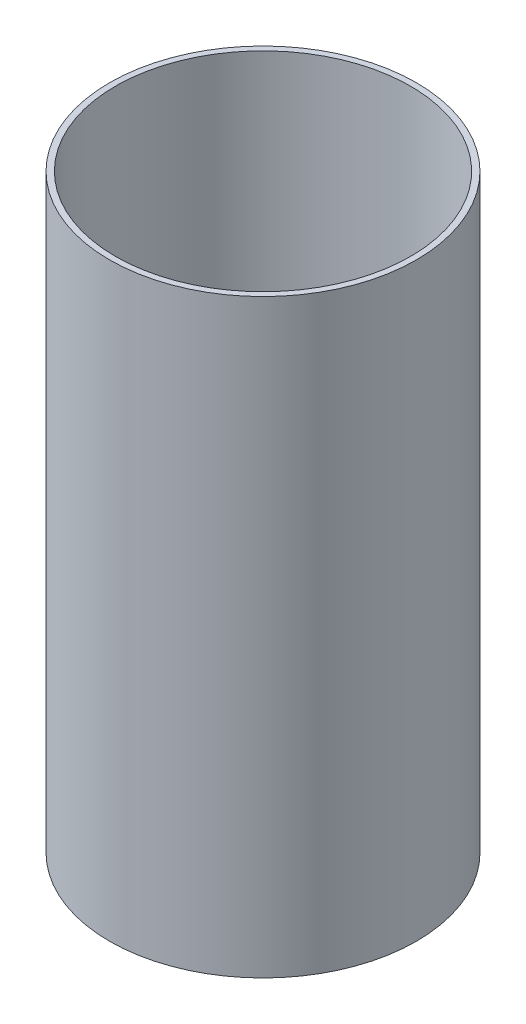
ISO-10303-21;
HEADER;
FILE_DESCRIPTION(('STEP AP214'),'2;1');
FILE_NAME('part.step','',(''),(''),'','','');
FILE_SCHEMA(('AUTOMOTIVE_DESIGN { 1 0 10303 214 1 1 1 1 }'));
ENDSEC;
DATA;
#1=APPLICATION_CONTEXT('core data for automotive mechanical design processes');
#2=APPLICATION_PROTOCOL_DEFINITION('international standard','automotive_design',2000,#1);
#3=PRODUCT_CONTEXT('',#1,'mechanical');
#4=PRODUCT('Part','Part','',(#3));
#5=PRODUCT_RELATED_PRODUCT_CATEGORY('part','',(#4));
#6=PRODUCT_DEFINITION_FORMATION('','',#4);
#7=PRODUCT_DEFINITION_CONTEXT('part definition',#1,'design');
#8=PRODUCT_DEFINITION('design','',#6,#7);
#9=PRODUCT_DEFINITION_SHAPE('','',#8);
#10=(LENGTH_UNIT() NAMED_UNIT(*) SI_UNIT(.MILLI.,.METRE.));
#11=(NAMED_UNIT(*) PLANE_ANGLE_UNIT() SI_UNIT($,.RADIAN.));
#12=(NAMED_UNIT(*) SI_UNIT($,.STERADIAN.) SOLID_ANGLE_UNIT());
#13=UNCERTAINTY_MEASURE_WITH_UNIT(LENGTH_MEASURE(1.E-05),#10,'distance_accuracy_value','');
#14=(GEOMETRIC_REPRESENTATION_CONTEXT(3) GLOBAL_UNCERTAINTY_ASSIGNED_CONTEXT((#13)) GLOBAL_UNIT_ASSIGNED_CONTEXT((#10,
#11,#12)) REPRESENTATION_CONTEXT('',''));
#15=CARTESIAN_POINT('',(0.,0.,0.));
#16=DIRECTION('',(0.,0.,1.));
#17=DIRECTION('',(1.,0.,0.));
#18=AXIS2_PLACEMENT_3D('',#15,#16,#17);
#19=CARTESIAN_POINT('',(0.,100.,0.));
#20=DIRECTION('',(0.,1.,0.));
#21=DIRECTION('',(0.,0.,1.));
#22=AXIS2_PLACEMENT_3D('',#19,#20,#21);
#23=PLANE('',#22);
#24=CARTESIAN_POINT('',(0.,100.,0.));
#25=DIRECTION('',(0.,1.,0.));
#26=DIRECTION('',(0.,0.,1.));
#27=AXIS2_PLACEMENT_3D('',#24,#25,#26);
#28=CIRCLE('',#27,26.);
#29=CARTESIAN_POINT('',(0.,100.,26.));
#30=VERTEX_POINT('',#29);
#31=EDGE_CURVE('E10',#30,#30,#28,.T.);
#32=ORIENTED_EDGE('',*,*,#31,.T.);
#33=EDGE_LOOP('',(#32));
#34=FACE_BOUND('',#33,.T.);
#35=CARTESIAN_POINT('',(0.,100.,0.));
#36=DIRECTION('',(0.,1.,0.));
#37=DIRECTION('',(0.,0.,1.));
#38=AXIS2_PLACEMENT_3D('',#35,#36,#37);
#39=CIRCLE('',#38,25.);
#40=CARTESIAN_POINT('',(0.,100.,25.));
#41=VERTEX_POINT('',#40);
#42=EDGE_CURVE('E48',#41,#41,#39,.T.);
#43=ORIENTED_EDGE('',*,*,#42,.F.);
#44=EDGE_LOOP('',(#43));
#45=FACE_BOUND('',#44,.T.);
#46=ADVANCED_FACE('F37',(#34,#45),#23,.T.);
#47=CARTESIAN_POINT('',(0.,0.,0.));
#48=DIRECTION('',(0.,1.,0.));
#49=DIRECTION('',(0.,0.,1.));
#50=AXIS2_PLACEMENT_3D('',#47,#48,#49);
#51=PLANE('',#50);
#52=CARTESIAN_POINT('',(0.,0.,0.));
#53=DIRECTION('',(0.,1.,0.));
#54=DIRECTION('',(0.,0.,1.));
#55=AXIS2_PLACEMENT_3D('',#52,#53,#54);
#56=CIRCLE('',#55,26.);
#57=CARTESIAN_POINT('',(0.,0.,26.));
#58=VERTEX_POINT('',#57);
#59=EDGE_CURVE('E41',#58,#58,#56,.T.);
#60=ORIENTED_EDGE('',*,*,#59,.F.);
#61=EDGE_LOOP('',(#60));
#62=FACE_BOUND('',#61,.T.);
#63=CARTESIAN_POINT('',(0.,0.,0.));
#64=DIRECTION('',(0.,1.,0.));
#65=DIRECTION('',(0.,0.,1.));
#66=AXIS2_PLACEMENT_3D('',#63,#64,#65);
#67=CIRCLE('',#66,25.);
#68=CARTESIAN_POINT('',(0.,0.,25.));
#69=VERTEX_POINT('',#68);
#70=EDGE_CURVE('E50',#69,#69,#67,.T.);
#71=ORIENTED_EDGE('',*,*,#70,.T.);
#72=EDGE_LOOP('',(#71));
#73=FACE_BOUND('',#72,.T.);
#74=ADVANCED_FACE('F60',(#62,#73),#51,.F.);
#75=CARTESIAN_POINT('',(0.,100.,0.));
#76=DIRECTION('',(0.,-1.,0.));
#77=DIRECTION('',(0.,0.,-1.));
#78=AXIS2_PLACEMENT_3D('',#75,#76,#77);
#79=CYLINDRICAL_SURFACE('',#78,26.);
#80=ORIENTED_EDGE('',*,*,#31,.F.);
#81=EDGE_LOOP('',(#80));
#82=FACE_BOUND('',#81,.T.);
#83=ORIENTED_EDGE('',*,*,#59,.T.);
#84=EDGE_LOOP('',(#83));
#85=FACE_BOUND('',#84,.T.);
#86=ADVANCED_FACE('F39',(#82,#85),#79,.T.);
#87=CARTESIAN_POINT('',(0.,100.,0.));
#88=DIRECTION('',(0.,-1.,0.));
#89=DIRECTION('',(0.,0.,-1.));
#90=AXIS2_PLACEMENT_3D('',#87,#88,#89);
#91=CYLINDRICAL_SURFACE('',#90,25.);
#92=ORIENTED_EDGE('',*,*,#42,.T.);
#93=EDGE_LOOP('',(#92));
#94=FACE_BOUND('',#93,.T.);
#95=ORIENTED_EDGE('',*,*,#70,.F.);
#96=EDGE_LOOP('',(#95));
#97=FACE_BOUND('',#96,.T.);
#98=ADVANCED_FACE('F56',(#94,#97),#91,.F.);
#99=CLOSED_SHELL('',(#46,#74,#86,#98));
#100=MANIFOLD_SOLID_BREP('B2',#99);
#101=ADVANCED_BREP_SHAPE_REPRESENTATION('',(#18,#100),#14);
#102=SHAPE_DEFINITION_REPRESENTATION(#9,#101);
ENDSEC;
END-ISO-10303-21;
